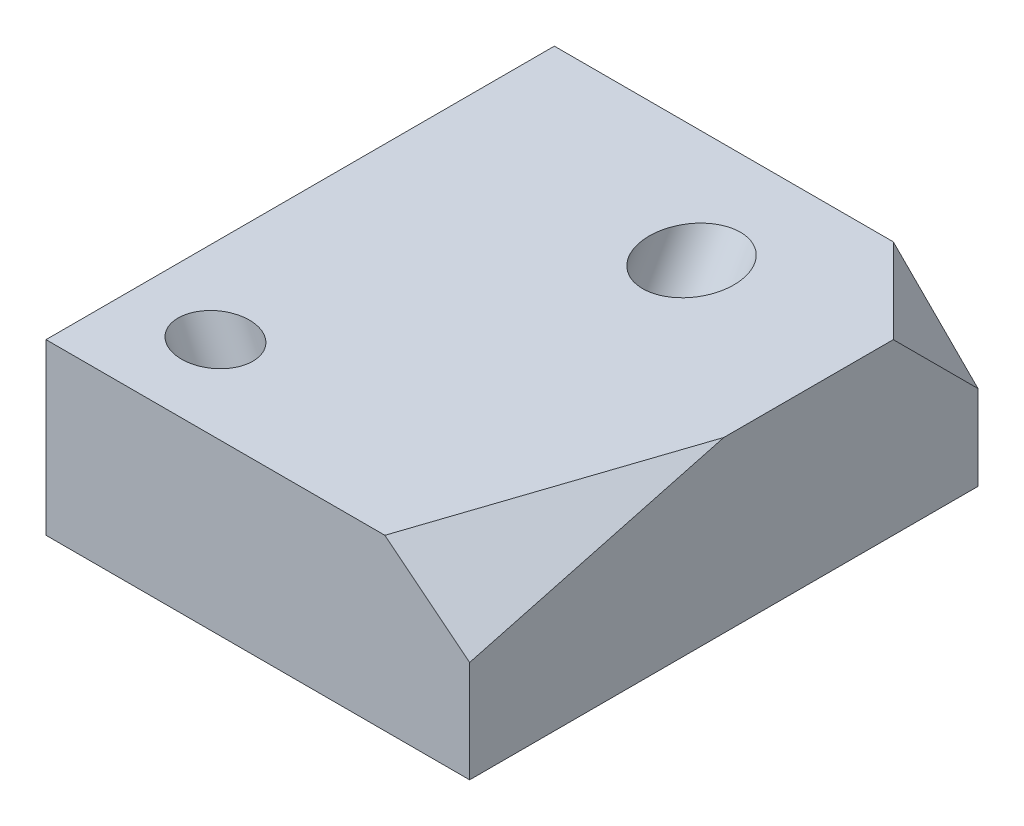
ISO-10303-21;
HEADER;
FILE_DESCRIPTION(('STEP AP214'),'2;1');
FILE_NAME('part.step','',(''),(''),'','','');
FILE_SCHEMA(('AUTOMOTIVE_DESIGN { 1 0 10303 214 1 1 1 1 }'));
ENDSEC;
DATA;
#1=APPLICATION_CONTEXT('core data for automotive mechanical design processes');
#2=APPLICATION_PROTOCOL_DEFINITION('international standard','automotive_design',2000,#1);
#3=PRODUCT_CONTEXT('',#1,'mechanical');
#4=PRODUCT('Part','Part','',(#3));
#5=PRODUCT_RELATED_PRODUCT_CATEGORY('part','',(#4));
#6=PRODUCT_DEFINITION_FORMATION('','',#4);
#7=PRODUCT_DEFINITION_CONTEXT('part definition',#1,'design');
#8=PRODUCT_DEFINITION('design','',#6,#7);
#9=PRODUCT_DEFINITION_SHAPE('','',#8);
#10=(LENGTH_UNIT() NAMED_UNIT(*) SI_UNIT(.MILLI.,.METRE.));
#11=(NAMED_UNIT(*) PLANE_ANGLE_UNIT() SI_UNIT($,.RADIAN.));
#12=(NAMED_UNIT(*) SI_UNIT($,.STERADIAN.) SOLID_ANGLE_UNIT());
#13=UNCERTAINTY_MEASURE_WITH_UNIT(LENGTH_MEASURE(1.E-05),#10,'distance_accuracy_value','');
#14=(GEOMETRIC_REPRESENTATION_CONTEXT(3) GLOBAL_UNCERTAINTY_ASSIGNED_CONTEXT((#13)) GLOBAL_UNIT_ASSIGNED_CONTEXT((#10,
#11,#12)) REPRESENTATION_CONTEXT('',''));
#15=CARTESIAN_POINT('',(0.,0.,0.));
#16=DIRECTION('',(0.,0.,1.));
#17=DIRECTION('',(1.,0.,0.));
#18=AXIS2_PLACEMENT_3D('',#15,#16,#17);
#19=CARTESIAN_POINT('',(63.5,50.8,76.2));
#20=DIRECTION('',(-1.,0.,0.));
#21=DIRECTION('',(0.,0.,1.));
#22=AXIS2_PLACEMENT_3D('',#19,#20,#21);
#23=PLANE('',#22);
#24=DIRECTION('',(0.,-1.,0.));
#25=VECTOR('',#24,1.);
#26=CARTESIAN_POINT('',(63.5,50.8,-76.2));
#27=LINE('',#26,#25);
#28=CARTESIAN_POINT('',(63.5,25.4,-76.2));
#29=VERTEX_POINT('',#28);
#30=CARTESIAN_POINT('',(63.5,0.,-76.2));
#31=VERTEX_POINT('',#30);
#32=EDGE_CURVE('E11',#29,#31,#27,.T.);
#33=ORIENTED_EDGE('',*,*,#32,.F.);
#34=DIRECTION('',(0.,-0.707106781186546,-0.707106781186549));
#35=VECTOR('',#34,1.);
#36=CARTESIAN_POINT('',(63.5,25.4,-76.2));
#37=LINE('',#36,#35);
#38=CARTESIAN_POINT('',(63.5,50.8,-50.7999999999999));
#39=VERTEX_POINT('',#38);
#40=EDGE_CURVE('E55',#39,#29,#37,.T.);
#41=ORIENTED_EDGE('',*,*,#40,.F.);
#42=DIRECTION('',(0.,0.,-1.));
#43=VECTOR('',#42,1.);
#44=CARTESIAN_POINT('',(63.5,50.8,76.2));
#45=LINE('',#44,#43);
#46=CARTESIAN_POINT('',(63.5,50.8,0.));
#47=VERTEX_POINT('',#46);
#48=EDGE_CURVE('E101',#47,#39,#45,.T.);
#49=ORIENTED_EDGE('',*,*,#48,.F.);
#50=DIRECTION('',(0.,0.257662650560332,-0.966234939601246));
#51=VECTOR('',#50,1.);
#52=CARTESIAN_POINT('',(63.5,50.8,0.));
#53=LINE('',#52,#51);
#54=CARTESIAN_POINT('',(63.5,30.48,76.2));
#55=VERTEX_POINT('',#54);
#56=EDGE_CURVE('E63',#55,#47,#53,.T.);
#57=ORIENTED_EDGE('',*,*,#56,.F.);
#58=DIRECTION('',(0.,-1.,0.));
#59=VECTOR('',#58,1.);
#60=CARTESIAN_POINT('',(63.5,50.8,76.2));
#61=LINE('',#60,#59);
#62=CARTESIAN_POINT('',(63.5,0.,76.2));
#63=VERTEX_POINT('',#62);
#64=EDGE_CURVE('E121',#55,#63,#61,.T.);
#65=ORIENTED_EDGE('',*,*,#64,.T.);
#66=DIRECTION('',(0.,0.,-1.));
#67=VECTOR('',#66,1.);
#68=CARTESIAN_POINT('',(63.5,0.,76.2));
#69=LINE('',#68,#67);
#70=EDGE_CURVE('E122',#63,#31,#69,.T.);
#71=ORIENTED_EDGE('',*,*,#70,.T.);
#72=EDGE_LOOP('',(#33,#41,#49,#57,#65,#71));
#73=FACE_BOUND('',#72,.T.);
#74=ADVANCED_FACE('F39',(#73),#23,.F.);
#75=CARTESIAN_POINT('',(-63.5,50.8,76.2));
#76=DIRECTION('',(0.,0.,-1.));
#77=DIRECTION('',(-1.,0.,0.));
#78=AXIS2_PLACEMENT_3D('',#75,#76,#77);
#79=PLANE('',#78);
#80=DIRECTION('',(0.78086880944303,-0.624695047554424,0.));
#81=VECTOR('',#80,1.);
#82=CARTESIAN_POINT('',(63.5,30.48,76.2));
#83=LINE('',#82,#81);
#84=CARTESIAN_POINT('',(38.1,50.8,76.2));
#85=VERTEX_POINT('',#84);
#86=EDGE_CURVE('E146',#85,#55,#83,.T.);
#87=ORIENTED_EDGE('',*,*,#86,.F.);
#88=DIRECTION('',(1.,0.,0.));
#89=VECTOR('',#88,1.);
#90=CARTESIAN_POINT('',(-63.5,50.8,76.2));
#91=LINE('',#90,#89);
#92=CARTESIAN_POINT('',(-63.5,50.8,76.2));
#93=VERTEX_POINT('',#92);
#94=EDGE_CURVE('E119',#93,#85,#91,.T.);
#95=ORIENTED_EDGE('',*,*,#94,.F.);
#96=DIRECTION('',(0.,-1.,0.));
#97=VECTOR('',#96,1.);
#98=CARTESIAN_POINT('',(-63.5,50.8,76.2));
#99=LINE('',#98,#97);
#100=CARTESIAN_POINT('',(-63.5,0.,76.2));
#101=VERTEX_POINT('',#100);
#102=EDGE_CURVE('E128',#93,#101,#99,.T.);
#103=ORIENTED_EDGE('',*,*,#102,.T.);
#104=DIRECTION('',(1.,0.,0.));
#105=VECTOR('',#104,1.);
#106=CARTESIAN_POINT('',(-63.5,0.,76.2));
#107=LINE('',#106,#105);
#108=EDGE_CURVE('E108',#101,#63,#107,.T.);
#109=ORIENTED_EDGE('',*,*,#108,.T.);
#110=ORIENTED_EDGE('',*,*,#64,.F.);
#111=EDGE_LOOP('',(#87,#95,#103,#109,#110));
#112=FACE_BOUND('',#111,.T.);
#113=ADVANCED_FACE('F152',(#112),#79,.F.);
#114=CARTESIAN_POINT('',(0.,50.8,0.));
#115=DIRECTION('',(0.,-1.,0.));
#116=DIRECTION('',(0.,0.,-1.));
#117=AXIS2_PLACEMENT_3D('',#114,#115,#116);
#118=PLANE('',#117);
#119=CARTESIAN_POINT('',(12.7,50.8,-41.117574699332));
#120=DIRECTION('',(0.,-1.,0.));
#121=DIRECTION('',(0.,0.,-1.));
#122=AXIS2_PLACEMENT_3D('',#119,#120,#121);
#123=ELLIPSE('',#122,14.6646968374165,12.7);
#124=CARTESIAN_POINT('',(12.7,50.8,-55.7822715367485));
#125=VERTEX_POINT('',#124);
#126=EDGE_CURVE('E134',#125,#125,#123,.T.);
#127=ORIENTED_EDGE('',*,*,#126,.T.);
#128=EDGE_LOOP('',(#127));
#129=FACE_BOUND('',#128,.T.);
#130=CARTESIAN_POINT('',(-38.1,50.8,50.8));
#131=DIRECTION('',(0.,-1.,0.));
#132=DIRECTION('',(-1.,0.,0.));
#133=AXIS2_PLACEMENT_3D('',#130,#131,#132);
#134=ELLIPSE('',#133,11.2103196566589,10.16);
#135=CARTESIAN_POINT('',(-49.3103196566589,50.8,50.8));
#136=VERTEX_POINT('',#135);
#137=EDGE_CURVE('E96',#136,#136,#134,.T.);
#138=ORIENTED_EDGE('',*,*,#137,.T.);
#139=EDGE_LOOP('',(#138));
#140=FACE_BOUND('',#139,.T.);
#141=ORIENTED_EDGE('',*,*,#48,.T.);
#142=DIRECTION('',(0.707106781186547,0.,0.707106781186548));
#143=VECTOR('',#142,1.);
#144=CARTESIAN_POINT('',(63.5,50.8,-50.7999999999999));
#145=LINE('',#144,#143);
#146=CARTESIAN_POINT('',(38.1,50.8,-76.2));
#147=VERTEX_POINT('',#146);
#148=EDGE_CURVE('E90',#147,#39,#145,.T.);
#149=ORIENTED_EDGE('',*,*,#148,.F.);
#150=DIRECTION('',(-1.,0.,0.));
#151=VECTOR('',#150,1.);
#152=CARTESIAN_POINT('',(-63.5,50.8,-76.2));
#153=LINE('',#152,#151);
#154=CARTESIAN_POINT('',(-63.5,50.8,-76.2));
#155=VERTEX_POINT('',#154);
#156=EDGE_CURVE('E107',#147,#155,#153,.T.);
#157=ORIENTED_EDGE('',*,*,#156,.T.);
#158=DIRECTION('',(0.,0.,1.));
#159=VECTOR('',#158,1.);
#160=CARTESIAN_POINT('',(-63.5,50.8,76.2));
#161=LINE('',#160,#159);
#162=EDGE_CURVE('E110',#155,#93,#161,.T.);
#163=ORIENTED_EDGE('',*,*,#162,.T.);
#164=ORIENTED_EDGE('',*,*,#94,.T.);
#165=DIRECTION('',(-0.316227766016838,0.,0.948683298050514));
#166=VECTOR('',#165,1.);
#167=CARTESIAN_POINT('',(38.1,50.8,76.2));
#168=LINE('',#167,#166);
#169=EDGE_CURVE('E106',#47,#85,#168,.T.);
#170=ORIENTED_EDGE('',*,*,#169,.F.);
#171=EDGE_LOOP('',(#141,#149,#157,#163,#164,#170));
#172=FACE_BOUND('',#171,.T.);
#173=ADVANCED_FACE('F104',(#129,#140,#172),#118,.F.);
#174=CARTESIAN_POINT('',(-63.5,50.8,-76.2));
#175=DIRECTION('',(0.,0.,1.));
#176=DIRECTION('',(1.,0.,0.));
#177=AXIS2_PLACEMENT_3D('',#174,#175,#176);
#178=PLANE('',#177);
#179=ORIENTED_EDGE('',*,*,#156,.F.);
#180=DIRECTION('',(-0.707106781186548,0.707106781186547,0.));
#181=VECTOR('',#180,1.);
#182=CARTESIAN_POINT('',(38.1,50.8,-76.2));
#183=LINE('',#182,#181);
#184=EDGE_CURVE('E92',#29,#147,#183,.T.);
#185=ORIENTED_EDGE('',*,*,#184,.F.);
#186=ORIENTED_EDGE('',*,*,#32,.T.);
#187=DIRECTION('',(-1.,0.,0.));
#188=VECTOR('',#187,1.);
#189=CARTESIAN_POINT('',(-63.5,0.,-76.2));
#190=LINE('',#189,#188);
#191=CARTESIAN_POINT('',(-63.5,0.,-76.2));
#192=VERTEX_POINT('',#191);
#193=EDGE_CURVE('E124',#31,#192,#190,.T.);
#194=ORIENTED_EDGE('',*,*,#193,.T.);
#195=DIRECTION('',(0.,-1.,0.));
#196=VECTOR('',#195,1.);
#197=CARTESIAN_POINT('',(-63.5,50.8,-76.2));
#198=LINE('',#197,#196);
#199=EDGE_CURVE('E47',#155,#192,#198,.T.);
#200=ORIENTED_EDGE('',*,*,#199,.F.);
#201=EDGE_LOOP('',(#179,#185,#186,#194,#200));
#202=FACE_BOUND('',#201,.T.);
#203=ADVANCED_FACE('F165',(#202),#178,.F.);
#204=CARTESIAN_POINT('',(-63.5,50.8,76.2));
#205=DIRECTION('',(1.,0.,0.));
#206=DIRECTION('',(0.,0.,-1.));
#207=AXIS2_PLACEMENT_3D('',#204,#205,#206);
#208=PLANE('',#207);
#209=DIRECTION('',(0.,0.,1.));
#210=VECTOR('',#209,1.);
#211=CARTESIAN_POINT('',(-63.5,0.,76.2));
#212=LINE('',#211,#210);
#213=EDGE_CURVE('E113',#192,#101,#212,.T.);
#214=ORIENTED_EDGE('',*,*,#213,.T.);
#215=ORIENTED_EDGE('',*,*,#102,.F.);
#216=ORIENTED_EDGE('',*,*,#162,.F.);
#217=ORIENTED_EDGE('',*,*,#199,.T.);
#218=EDGE_LOOP('',(#214,#215,#216,#217));
#219=FACE_BOUND('',#218,.T.);
#220=ADVANCED_FACE('F157',(#219),#208,.F.);
#221=CARTESIAN_POINT('',(0.,0.,0.));
#222=DIRECTION('',(0.,-1.,0.));
#223=DIRECTION('',(0.,0.,-1.));
#224=AXIS2_PLACEMENT_3D('',#221,#222,#223);
#225=PLANE('',#224);
#226=CARTESIAN_POINT('',(12.7,0.,-11.788181024499));
#227=DIRECTION('',(0.,-1.,0.));
#228=DIRECTION('',(0.,0.,-1.));
#229=AXIS2_PLACEMENT_3D('',#226,#227,#228);
#230=ELLIPSE('',#229,14.6646968374165,12.7);
#231=CARTESIAN_POINT('',(12.7,0.,-26.4528778619155));
#232=VERTEX_POINT('',#231);
#233=EDGE_CURVE('E42',#232,#232,#230,.T.);
#234=ORIENTED_EDGE('',*,*,#233,.F.);
#235=EDGE_LOOP('',(#234));
#236=FACE_BOUND('',#235,.T.);
#237=CARTESIAN_POINT('',(-14.411570965726,0.,50.8));
#238=DIRECTION('',(0.,-1.,0.));
#239=DIRECTION('',(-1.,0.,0.));
#240=AXIS2_PLACEMENT_3D('',#237,#238,#239);
#241=ELLIPSE('',#240,11.2103196566589,10.16);
#242=CARTESIAN_POINT('',(-25.621890622385,0.,50.8));
#243=VERTEX_POINT('',#242);
#244=EDGE_CURVE('E132',#243,#243,#241,.T.);
#245=ORIENTED_EDGE('',*,*,#244,.F.);
#246=EDGE_LOOP('',(#245));
#247=FACE_BOUND('',#246,.T.);
#248=ORIENTED_EDGE('',*,*,#70,.F.);
#249=ORIENTED_EDGE('',*,*,#108,.F.);
#250=ORIENTED_EDGE('',*,*,#213,.F.);
#251=ORIENTED_EDGE('',*,*,#193,.F.);
#252=EDGE_LOOP('',(#248,#249,#250,#251));
#253=FACE_BOUND('',#252,.T.);
#254=ADVANCED_FACE('F162',(#236,#247,#253),#225,.T.);
#255=CARTESIAN_POINT('',(47.5012987012987,59.3766233766234,15.8337662337662));
#256=DIRECTION('',(0.611576629725151,0.764470787156438,0.20385887657505));
#257=DIRECTION('',(-0.78086880944303,0.624695047554425,0.));
#258=AXIS2_PLACEMENT_3D('',#255,#256,#257);
#259=PLANE('',#258);
#260=ORIENTED_EDGE('',*,*,#86,.T.);
#261=ORIENTED_EDGE('',*,*,#56,.T.);
#262=ORIENTED_EDGE('',*,*,#169,.T.);
#263=EDGE_LOOP('',(#260,#261,#262));
#264=FACE_BOUND('',#263,.T.);
#265=ADVANCED_FACE('F148',(#264),#259,.T.);
#266=CARTESIAN_POINT('',(55.0333333333333,55.0333333333334,-55.0333333333332));
#267=DIRECTION('',(-0.577350269189626,-0.577350269189627,0.577350269189625));
#268=DIRECTION('',(0.707106781186548,-0.707106781186547,0.));
#269=AXIS2_PLACEMENT_3D('',#266,#267,#268);
#270=PLANE('',#269);
#271=ORIENTED_EDGE('',*,*,#148,.T.);
#272=ORIENTED_EDGE('',*,*,#40,.T.);
#273=ORIENTED_EDGE('',*,*,#184,.T.);
#274=EDGE_LOOP('',(#271,#272,#273));
#275=FACE_BOUND('',#274,.T.);
#276=ADVANCED_FACE('F91',(#275),#270,.F.);
#277=CARTESIAN_POINT('',(-0.496081716854065,-29.8418629964822,50.8));
#278=DIRECTION('',(-0.4226182617407,0.906307787036649,0.));
#279=DIRECTION('',(-0.90630778703665,-0.4226182617407,0.));
#280=AXIS2_PLACEMENT_3D('',#277,#278,#279);
#281=CYLINDRICAL_SURFACE('',#280,10.16);
#282=ORIENTED_EDGE('',*,*,#244,.T.);
#283=EDGE_LOOP('',(#282));
#284=FACE_BOUND('',#283,.T.);
#285=ORIENTED_EDGE('',*,*,#137,.F.);
#286=EDGE_LOOP('',(#285));
#287=FACE_BOUND('',#286,.T.);
#288=ADVANCED_FACE('F188',(#284,#287),#281,.F.);
#289=CARTESIAN_POINT('',(12.7,-38.1000000000001,10.2088642316259));
#290=DIRECTION('',(0.,0.866025403784438,-0.500000000000001));
#291=DIRECTION('',(0.,0.500000000000001,0.866025403784438));
#292=AXIS2_PLACEMENT_3D('',#289,#290,#291);
#293=CYLINDRICAL_SURFACE('',#292,12.7);
#294=ORIENTED_EDGE('',*,*,#233,.T.);
#295=EDGE_LOOP('',(#294));
#296=FACE_BOUND('',#295,.T.);
#297=ORIENTED_EDGE('',*,*,#126,.F.);
#298=EDGE_LOOP('',(#297));
#299=FACE_BOUND('',#298,.T.);
#300=ADVANCED_FACE('F191',(#296,#299),#293,.F.);
#301=CLOSED_SHELL('',(#74,#113,#173,#203,#220,#254,#265,#276,#288,#300));
#302=MANIFOLD_SOLID_BREP('B2',#301);
#303=ADVANCED_BREP_SHAPE_REPRESENTATION('',(#18,#302),#14);
#304=SHAPE_DEFINITION_REPRESENTATION(#9,#303);
ENDSEC;
END-ISO-10303-21;
